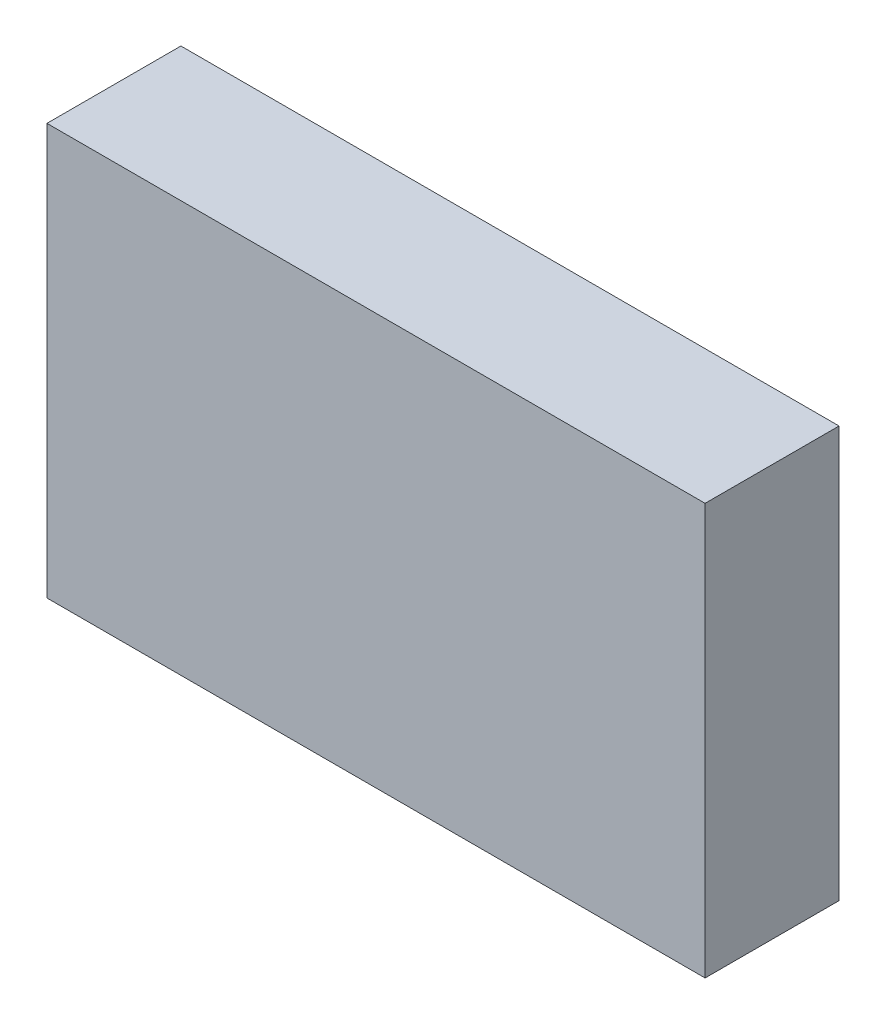
ISO-10303-21;
HEADER;
FILE_DESCRIPTION(('STEP AP214'),'2;1');
FILE_NAME('part.step','',(''),(''),'','','');
FILE_SCHEMA(('AUTOMOTIVE_DESIGN { 1 0 10303 214 1 1 1 1 }'));
ENDSEC;
DATA;
#1=APPLICATION_CONTEXT('core data for automotive mechanical design processes');
#2=APPLICATION_PROTOCOL_DEFINITION('international standard','automotive_design',2000,#1);
#3=PRODUCT_CONTEXT('',#1,'mechanical');
#4=PRODUCT('Part','Part','',(#3));
#5=PRODUCT_RELATED_PRODUCT_CATEGORY('part','',(#4));
#6=PRODUCT_DEFINITION_FORMATION('','',#4);
#7=PRODUCT_DEFINITION_CONTEXT('part definition',#1,'design');
#8=PRODUCT_DEFINITION('design','',#6,#7);
#9=PRODUCT_DEFINITION_SHAPE('','',#8);
#10=(LENGTH_UNIT() NAMED_UNIT(*) SI_UNIT(.MILLI.,.METRE.));
#11=(NAMED_UNIT(*) PLANE_ANGLE_UNIT() SI_UNIT($,.RADIAN.));
#12=(NAMED_UNIT(*) SI_UNIT($,.STERADIAN.) SOLID_ANGLE_UNIT());
#13=UNCERTAINTY_MEASURE_WITH_UNIT(LENGTH_MEASURE(1.E-05),#10,'distance_accuracy_value','');
#14=(GEOMETRIC_REPRESENTATION_CONTEXT(3) GLOBAL_UNCERTAINTY_ASSIGNED_CONTEXT((#13)) GLOBAL_UNIT_ASSIGNED_CONTEXT((#10,
#11,#12)) REPRESENTATION_CONTEXT('',''));
#15=CARTESIAN_POINT('',(0.,0.,0.));
#16=DIRECTION('',(0.,0.,1.));
#17=DIRECTION('',(1.,0.,0.));
#18=AXIS2_PLACEMENT_3D('',#15,#16,#17);
#19=CARTESIAN_POINT('',(-74.7827650520007,29.1421354359442,23.));
#20=DIRECTION('',(1.,0.,0.));
#21=DIRECTION('',(0.,0.,-1.));
#22=AXIS2_PLACEMENT_3D('',#19,#20,#21);
#23=PLANE('',#22);
#24=DIRECTION('',(0.,-1.,0.));
#25=VECTOR('',#24,1.);
#26=CARTESIAN_POINT('',(-74.7827650520007,29.1421354359442,0.));
#27=LINE('',#26,#25);
#28=CARTESIAN_POINT('',(-74.7827650520007,29.1421354359442,0.));
#29=VERTEX_POINT('',#28);
#30=CARTESIAN_POINT('',(-74.7827650520007,-41.4408203738747,0.));
#31=VERTEX_POINT('',#30);
#32=EDGE_CURVE('E105',#29,#31,#27,.T.);
#33=ORIENTED_EDGE('',*,*,#32,.T.);
#34=DIRECTION('',(0.,0.,-1.));
#35=VECTOR('',#34,1.);
#36=CARTESIAN_POINT('',(-74.7827650520007,-41.4408203738747,23.));
#37=LINE('',#36,#35);
#38=CARTESIAN_POINT('',(-74.7827650520007,-41.4408203738747,23.));
#39=VERTEX_POINT('',#38);
#40=EDGE_CURVE('E11',#39,#31,#37,.T.);
#41=ORIENTED_EDGE('',*,*,#40,.F.);
#42=DIRECTION('',(0.,-1.,0.));
#43=VECTOR('',#42,1.);
#44=CARTESIAN_POINT('',(-74.7827650520007,29.1421354359442,23.));
#45=LINE('',#44,#43);
#46=CARTESIAN_POINT('',(-74.7827650520007,29.1421354359442,23.));
#47=VERTEX_POINT('',#46);
#48=EDGE_CURVE('E89',#47,#39,#45,.T.);
#49=ORIENTED_EDGE('',*,*,#48,.F.);
#50=DIRECTION('',(0.,0.,-1.));
#51=VECTOR('',#50,1.);
#52=CARTESIAN_POINT('',(-74.7827650520007,29.1421354359442,23.));
#53=LINE('',#52,#51);
#54=EDGE_CURVE('E101',#47,#29,#53,.T.);
#55=ORIENTED_EDGE('',*,*,#54,.T.);
#56=EDGE_LOOP('',(#33,#41,#49,#55));
#57=FACE_BOUND('',#56,.T.);
#58=ADVANCED_FACE('F37',(#57),#23,.F.);
#59=CARTESIAN_POINT('',(-74.7827650520007,-41.4408203738747,23.));
#60=DIRECTION('',(0.,1.,0.));
#61=DIRECTION('',(0.,0.,1.));
#62=AXIS2_PLACEMENT_3D('',#59,#60,#61);
#63=PLANE('',#62);
#64=DIRECTION('',(1.,0.,0.));
#65=VECTOR('',#64,1.);
#66=CARTESIAN_POINT('',(-74.7827650520007,-41.4408203738747,0.));
#67=LINE('',#66,#65);
#68=CARTESIAN_POINT('',(38.221260158669,-41.4408203738747,0.));
#69=VERTEX_POINT('',#68);
#70=EDGE_CURVE('E94',#31,#69,#67,.T.);
#71=ORIENTED_EDGE('',*,*,#70,.T.);
#72=DIRECTION('',(0.,0.,-1.));
#73=VECTOR('',#72,1.);
#74=CARTESIAN_POINT('',(38.221260158669,-41.4408203738747,23.));
#75=LINE('',#74,#73);
#76=CARTESIAN_POINT('',(38.221260158669,-41.4408203738747,23.));
#77=VERTEX_POINT('',#76);
#78=EDGE_CURVE('E46',#77,#69,#75,.T.);
#79=ORIENTED_EDGE('',*,*,#78,.F.);
#80=DIRECTION('',(1.,0.,0.));
#81=VECTOR('',#80,1.);
#82=CARTESIAN_POINT('',(-74.7827650520007,-41.4408203738747,23.));
#83=LINE('',#82,#81);
#84=EDGE_CURVE('E84',#39,#77,#83,.T.);
#85=ORIENTED_EDGE('',*,*,#84,.F.);
#86=ORIENTED_EDGE('',*,*,#40,.T.);
#87=EDGE_LOOP('',(#71,#79,#85,#86));
#88=FACE_BOUND('',#87,.T.);
#89=ADVANCED_FACE('F93',(#88),#63,.F.);
#90=CARTESIAN_POINT('',(38.221260158669,29.1421354359442,23.));
#91=DIRECTION('',(-1.,0.,0.));
#92=DIRECTION('',(0.,0.,1.));
#93=AXIS2_PLACEMENT_3D('',#90,#91,#92);
#94=PLANE('',#93);
#95=DIRECTION('',(0.,1.,0.));
#96=VECTOR('',#95,1.);
#97=CARTESIAN_POINT('',(38.221260158669,29.1421354359442,0.));
#98=LINE('',#97,#96);
#99=CARTESIAN_POINT('',(38.221260158669,29.1421354359442,0.));
#100=VERTEX_POINT('',#99);
#101=EDGE_CURVE('E71',#69,#100,#98,.T.);
#102=ORIENTED_EDGE('',*,*,#101,.T.);
#103=DIRECTION('',(0.,0.,-1.));
#104=VECTOR('',#103,1.);
#105=CARTESIAN_POINT('',(38.221260158669,29.1421354359442,23.));
#106=LINE('',#105,#104);
#107=CARTESIAN_POINT('',(38.221260158669,29.1421354359442,23.));
#108=VERTEX_POINT('',#107);
#109=EDGE_CURVE('E96',#108,#100,#106,.T.);
#110=ORIENTED_EDGE('',*,*,#109,.F.);
#111=DIRECTION('',(0.,1.,0.));
#112=VECTOR('',#111,1.);
#113=CARTESIAN_POINT('',(38.221260158669,29.1421354359442,23.));
#114=LINE('',#113,#112);
#115=EDGE_CURVE('E87',#77,#108,#114,.T.);
#116=ORIENTED_EDGE('',*,*,#115,.F.);
#117=ORIENTED_EDGE('',*,*,#78,.T.);
#118=EDGE_LOOP('',(#102,#110,#116,#117));
#119=FACE_BOUND('',#118,.T.);
#120=ADVANCED_FACE('F97',(#119),#94,.F.);
#121=CARTESIAN_POINT('',(-74.7827650520007,29.1421354359442,23.));
#122=DIRECTION('',(0.,-1.,0.));
#123=DIRECTION('',(0.,0.,-1.));
#124=AXIS2_PLACEMENT_3D('',#121,#122,#123);
#125=PLANE('',#124);
#126=DIRECTION('',(-1.,0.,0.));
#127=VECTOR('',#126,1.);
#128=CARTESIAN_POINT('',(-74.7827650520007,29.1421354359442,0.));
#129=LINE('',#128,#127);
#130=EDGE_CURVE('E77',#100,#29,#129,.T.);
#131=ORIENTED_EDGE('',*,*,#130,.T.);
#132=ORIENTED_EDGE('',*,*,#54,.F.);
#133=DIRECTION('',(-1.,0.,0.));
#134=VECTOR('',#133,1.);
#135=CARTESIAN_POINT('',(-74.7827650520007,29.1421354359442,23.));
#136=LINE('',#135,#134);
#137=EDGE_CURVE('E54',#108,#47,#136,.T.);
#138=ORIENTED_EDGE('',*,*,#137,.F.);
#139=ORIENTED_EDGE('',*,*,#109,.T.);
#140=EDGE_LOOP('',(#131,#132,#138,#139));
#141=FACE_BOUND('',#140,.T.);
#142=ADVANCED_FACE('F118',(#141),#125,.F.);
#143=CARTESIAN_POINT('',(0.,0.,23.));
#144=DIRECTION('',(0.,0.,1.));
#145=DIRECTION('',(1.,0.,0.));
#146=AXIS2_PLACEMENT_3D('',#143,#144,#145);
#147=PLANE('',#146);
#148=ORIENTED_EDGE('',*,*,#48,.T.);
#149=ORIENTED_EDGE('',*,*,#84,.T.);
#150=ORIENTED_EDGE('',*,*,#115,.T.);
#151=ORIENTED_EDGE('',*,*,#137,.T.);
#152=EDGE_LOOP('',(#148,#149,#150,#151));
#153=FACE_BOUND('',#152,.T.);
#154=ADVANCED_FACE('F85',(#153),#147,.T.);
#155=CARTESIAN_POINT('',(0.,0.,0.));
#156=DIRECTION('',(0.,0.,1.));
#157=DIRECTION('',(1.,0.,0.));
#158=AXIS2_PLACEMENT_3D('',#155,#156,#157);
#159=PLANE('',#158);
#160=ORIENTED_EDGE('',*,*,#32,.F.);
#161=ORIENTED_EDGE('',*,*,#130,.F.);
#162=ORIENTED_EDGE('',*,*,#101,.F.);
#163=ORIENTED_EDGE('',*,*,#70,.F.);
#164=EDGE_LOOP('',(#160,#161,#162,#163));
#165=FACE_BOUND('',#164,.T.);
#166=ADVANCED_FACE('F121',(#165),#159,.F.);
#167=CLOSED_SHELL('',(#58,#89,#120,#142,#154,#166));
#168=MANIFOLD_SOLID_BREP('B2',#167);
#169=ADVANCED_BREP_SHAPE_REPRESENTATION('',(#18,#168),#14);
#170=SHAPE_DEFINITION_REPRESENTATION(#9,#169);
ENDSEC;
END-ISO-10303-21;
